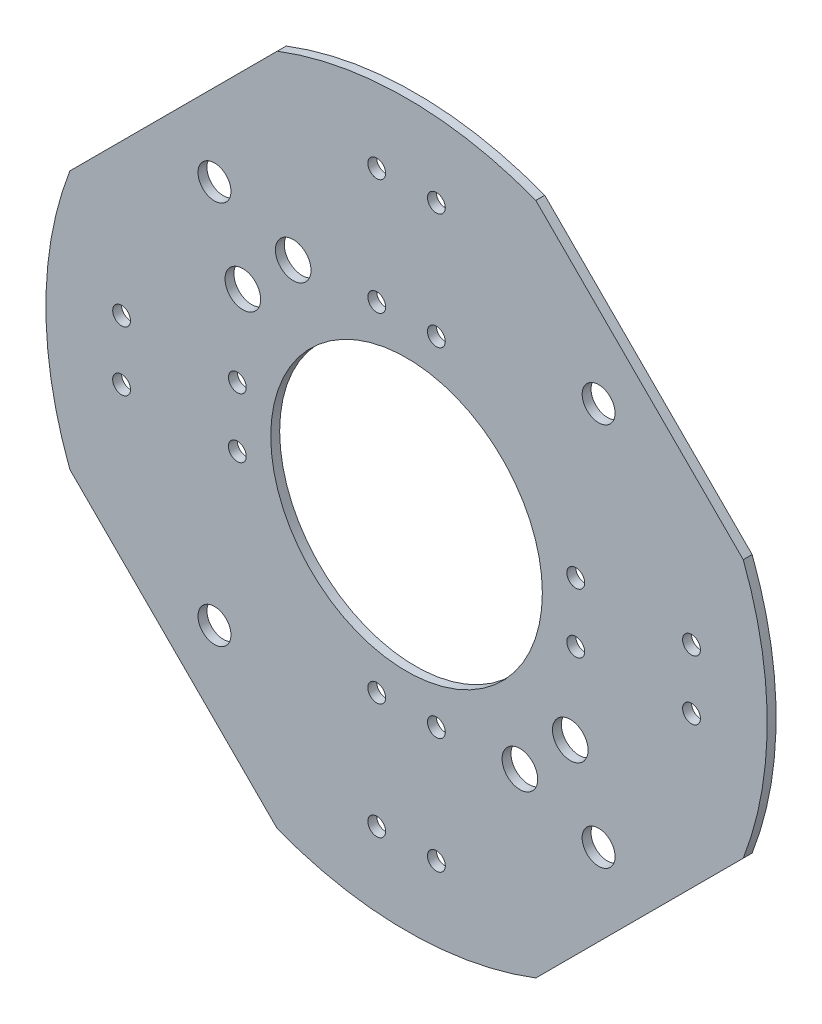
ISO-10303-21;
HEADER;
FILE_DESCRIPTION(('STEP AP214'),'2;1');
FILE_NAME('part.step','',(''),(''),'','','');
FILE_SCHEMA(('AUTOMOTIVE_DESIGN { 1 0 10303 214 1 1 1 1 }'));
ENDSEC;
DATA;
#1=APPLICATION_CONTEXT('core data for automotive mechanical design processes');
#2=APPLICATION_PROTOCOL_DEFINITION('international standard','automotive_design',2000,#1);
#3=PRODUCT_CONTEXT('',#1,'mechanical');
#4=PRODUCT('Part','Part','',(#3));
#5=PRODUCT_RELATED_PRODUCT_CATEGORY('part','',(#4));
#6=PRODUCT_DEFINITION_FORMATION('','',#4);
#7=PRODUCT_DEFINITION_CONTEXT('part definition',#1,'design');
#8=PRODUCT_DEFINITION('design','',#6,#7);
#9=PRODUCT_DEFINITION_SHAPE('','',#8);
#10=(LENGTH_UNIT() NAMED_UNIT(*) SI_UNIT(.MILLI.,.METRE.));
#11=(NAMED_UNIT(*) PLANE_ANGLE_UNIT() SI_UNIT($,.RADIAN.));
#12=(NAMED_UNIT(*) SI_UNIT($,.STERADIAN.) SOLID_ANGLE_UNIT());
#13=UNCERTAINTY_MEASURE_WITH_UNIT(LENGTH_MEASURE(1.E-05),#10,'distance_accuracy_value','');
#14=(GEOMETRIC_REPRESENTATION_CONTEXT(3) GLOBAL_UNCERTAINTY_ASSIGNED_CONTEXT((#13)) GLOBAL_UNIT_ASSIGNED_CONTEXT((#10,
#11,#12)) REPRESENTATION_CONTEXT('',''));
#15=CARTESIAN_POINT('',(0.,0.,0.));
#16=DIRECTION('',(0.,0.,1.));
#17=DIRECTION('',(1.,0.,0.));
#18=AXIS2_PLACEMENT_3D('',#15,#16,#17);
#19=CARTESIAN_POINT('',(0.,0.,1.));
#20=DIRECTION('',(0.,0.,1.));
#21=DIRECTION('',(1.,0.,0.));
#22=AXIS2_PLACEMENT_3D('',#19,#20,#21);
#23=PLANE('',#22);
#24=CARTESIAN_POINT('',(-3.35,-32.,1.));
#25=DIRECTION('',(0.,0.,1.));
#26=DIRECTION('',(1.,0.,0.));
#27=AXIS2_PLACEMENT_3D('',#24,#25,#26);
#28=CIRCLE('',#27,1.);
#29=CARTESIAN_POINT('',(-2.35,-32.,1.));
#30=VERTEX_POINT('',#29);
#31=EDGE_CURVE('E313',#30,#30,#28,.T.);
#32=ORIENTED_EDGE('',*,*,#31,.F.);
#33=EDGE_LOOP('',(#32));
#34=FACE_BOUND('',#33,.T.);
#35=CARTESIAN_POINT('',(3.35,-19.,1.));
#36=DIRECTION('',(0.,0.,1.));
#37=DIRECTION('',(-1.,0.,0.));
#38=AXIS2_PLACEMENT_3D('',#35,#36,#37);
#39=CIRCLE('',#38,1.);
#40=CARTESIAN_POINT('',(2.35,-19.,1.));
#41=VERTEX_POINT('',#40);
#42=EDGE_CURVE('E301',#41,#41,#39,.T.);
#43=ORIENTED_EDGE('',*,*,#42,.F.);
#44=EDGE_LOOP('',(#43));
#45=FACE_BOUND('',#44,.T.);
#46=CARTESIAN_POINT('',(-3.35,32.,1.));
#47=DIRECTION('',(0.,0.,1.));
#48=DIRECTION('',(-1.,0.,0.));
#49=AXIS2_PLACEMENT_3D('',#46,#47,#48);
#50=CIRCLE('',#49,1.);
#51=CARTESIAN_POINT('',(-4.35,32.,1.));
#52=VERTEX_POINT('',#51);
#53=EDGE_CURVE('E289',#52,#52,#50,.T.);
#54=ORIENTED_EDGE('',*,*,#53,.F.);
#55=EDGE_LOOP('',(#54));
#56=FACE_BOUND('',#55,.T.);
#57=CARTESIAN_POINT('',(3.35,19.,1.));
#58=DIRECTION('',(0.,0.,1.));
#59=DIRECTION('',(1.,0.,0.));
#60=AXIS2_PLACEMENT_3D('',#57,#58,#59);
#61=CIRCLE('',#60,1.);
#62=CARTESIAN_POINT('',(4.35,19.,1.));
#63=VERTEX_POINT('',#62);
#64=EDGE_CURVE('E277',#63,#63,#61,.T.);
#65=ORIENTED_EDGE('',*,*,#64,.F.);
#66=EDGE_LOOP('',(#65));
#67=FACE_BOUND('',#66,.T.);
#68=CARTESIAN_POINT('',(-32.,3.35,1.));
#69=DIRECTION('',(0.,0.,1.));
#70=DIRECTION('',(1.,0.,0.));
#71=AXIS2_PLACEMENT_3D('',#68,#69,#70);
#72=CIRCLE('',#71,0.999999999999998);
#73=CARTESIAN_POINT('',(-31.,3.35,1.));
#74=VERTEX_POINT('',#73);
#75=EDGE_CURVE('E265',#74,#74,#72,.T.);
#76=ORIENTED_EDGE('',*,*,#75,.F.);
#77=EDGE_LOOP('',(#76));
#78=FACE_BOUND('',#77,.T.);
#79=CARTESIAN_POINT('',(-19.,-3.35,1.));
#80=DIRECTION('',(0.,0.,1.));
#81=DIRECTION('',(-1.,0.,0.));
#82=AXIS2_PLACEMENT_3D('',#79,#80,#81);
#83=CIRCLE('',#82,1.);
#84=CARTESIAN_POINT('',(-20.,-3.35,1.));
#85=VERTEX_POINT('',#84);
#86=EDGE_CURVE('E253',#85,#85,#83,.T.);
#87=ORIENTED_EDGE('',*,*,#86,.F.);
#88=EDGE_LOOP('',(#87));
#89=FACE_BOUND('',#88,.T.);
#90=CARTESIAN_POINT('',(32.,3.35,1.));
#91=DIRECTION('',(0.,0.,1.));
#92=DIRECTION('',(-1.,0.,0.));
#93=AXIS2_PLACEMENT_3D('',#90,#91,#92);
#94=CIRCLE('',#93,0.999999999999998);
#95=CARTESIAN_POINT('',(31.,3.35,1.));
#96=VERTEX_POINT('',#95);
#97=EDGE_CURVE('E241',#96,#96,#94,.T.);
#98=ORIENTED_EDGE('',*,*,#97,.F.);
#99=EDGE_LOOP('',(#98));
#100=FACE_BOUND('',#99,.T.);
#101=CARTESIAN_POINT('',(19.,-3.35,1.));
#102=DIRECTION('',(0.,0.,1.));
#103=DIRECTION('',(1.,0.,0.));
#104=AXIS2_PLACEMENT_3D('',#101,#102,#103);
#105=CIRCLE('',#104,1.);
#106=CARTESIAN_POINT('',(20.,-3.35,1.));
#107=VERTEX_POINT('',#106);
#108=EDGE_CURVE('E229',#107,#107,#105,.T.);
#109=ORIENTED_EDGE('',*,*,#108,.F.);
#110=EDGE_LOOP('',(#109));
#111=FACE_BOUND('',#110,.T.);
#112=CARTESIAN_POINT('',(12.7279220613578,-18.3847763108502,1.));
#113=DIRECTION('',(0.,0.,1.));
#114=DIRECTION('',(1.,0.,0.));
#115=AXIS2_PLACEMENT_3D('',#112,#113,#114);
#116=CIRCLE('',#115,2.);
#117=CARTESIAN_POINT('',(14.7279220613578,-18.3847763108502,1.));
#118=VERTEX_POINT('',#117);
#119=EDGE_CURVE('E217',#118,#118,#116,.T.);
#120=ORIENTED_EDGE('',*,*,#119,.F.);
#121=EDGE_LOOP('',(#120));
#122=FACE_BOUND('',#121,.T.);
#123=CARTESIAN_POINT('',(-12.7279220613579,18.3847763108502,1.));
#124=DIRECTION('',(0.,0.,1.));
#125=DIRECTION('',(1.,0.,0.));
#126=AXIS2_PLACEMENT_3D('',#123,#124,#125);
#127=CIRCLE('',#126,2.);
#128=CARTESIAN_POINT('',(-10.7279220613579,18.3847763108502,1.));
#129=VERTEX_POINT('',#128);
#130=EDGE_CURVE('E205',#129,#129,#127,.T.);
#131=ORIENTED_EDGE('',*,*,#130,.F.);
#132=EDGE_LOOP('',(#131));
#133=FACE_BOUND('',#132,.T.);
#134=CARTESIAN_POINT('',(-21.5667568261897,21.5667568261897,1.));
#135=DIRECTION('',(0.,0.,1.));
#136=DIRECTION('',(1.,0.,0.));
#137=AXIS2_PLACEMENT_3D('',#134,#135,#136);
#138=CIRCLE('',#137,1.85);
#139=CARTESIAN_POINT('',(-19.7167568261897,21.5667568261897,1.));
#140=VERTEX_POINT('',#139);
#141=EDGE_CURVE('E193',#140,#140,#138,.T.);
#142=ORIENTED_EDGE('',*,*,#141,.F.);
#143=EDGE_LOOP('',(#142));
#144=FACE_BOUND('',#143,.T.);
#145=CARTESIAN_POINT('',(21.5667568261897,21.5667568261897,1.));
#146=DIRECTION('',(0.,0.,1.));
#147=DIRECTION('',(1.,0.,0.));
#148=AXIS2_PLACEMENT_3D('',#145,#146,#147);
#149=CIRCLE('',#148,1.85);
#150=CARTESIAN_POINT('',(23.4167568261897,21.5667568261897,1.));
#151=VERTEX_POINT('',#150);
#152=EDGE_CURVE('E181',#151,#151,#149,.T.);
#153=ORIENTED_EDGE('',*,*,#152,.F.);
#154=EDGE_LOOP('',(#153));
#155=FACE_BOUND('',#154,.T.);
#156=CARTESIAN_POINT('',(0.,0.,1.));
#157=DIRECTION('',(0.,0.,1.));
#158=DIRECTION('',(1.,0.,0.));
#159=AXIS2_PLACEMENT_3D('',#156,#157,#158);
#160=CIRCLE('',#159,40.5);
#161=CARTESIAN_POINT('',(37.8087656027544,-14.5171362050501,1.));
#162=VERTEX_POINT('',#161);
#163=CARTESIAN_POINT('',(37.8087656027544,14.5171362050501,1.));
#164=VERTEX_POINT('',#163);
#165=EDGE_CURVE('E144',#162,#164,#160,.T.);
#166=ORIENTED_EDGE('',*,*,#165,.T.);
#167=DIRECTION('',(-0.707106781186547,0.707106781186548,0.));
#168=VECTOR('',#167,1.);
#169=CARTESIAN_POINT('',(37.8087656027544,14.5171362050501,1.));
#170=LINE('',#169,#168);
#171=CARTESIAN_POINT('',(14.5171362050501,37.8087656027544,1.));
#172=VERTEX_POINT('',#171);
#173=EDGE_CURVE('E92',#164,#172,#170,.T.);
#174=ORIENTED_EDGE('',*,*,#173,.T.);
#175=CARTESIAN_POINT('',(0.,0.,1.));
#176=DIRECTION('',(0.,0.,1.));
#177=DIRECTION('',(1.,0.,0.));
#178=AXIS2_PLACEMENT_3D('',#175,#176,#177);
#179=CIRCLE('',#178,40.5);
#180=CARTESIAN_POINT('',(-14.5171362050501,37.8087656027544,1.));
#181=VERTEX_POINT('',#180);
#182=EDGE_CURVE('E159',#172,#181,#179,.T.);
#183=ORIENTED_EDGE('',*,*,#182,.T.);
#184=DIRECTION('',(-0.707106781186547,-0.707106781186548,0.));
#185=VECTOR('',#184,1.);
#186=CARTESIAN_POINT('',(-14.5171362050501,37.8087656027544,1.));
#187=LINE('',#186,#185);
#188=CARTESIAN_POINT('',(-37.8087656027544,14.5171362050501,1.));
#189=VERTEX_POINT('',#188);
#190=EDGE_CURVE('E172',#181,#189,#187,.T.);
#191=ORIENTED_EDGE('',*,*,#190,.T.);
#192=CARTESIAN_POINT('',(0.,0.,1.));
#193=DIRECTION('',(0.,0.,1.));
#194=DIRECTION('',(1.,0.,0.));
#195=AXIS2_PLACEMENT_3D('',#192,#193,#194);
#196=CIRCLE('',#195,40.5);
#197=CARTESIAN_POINT('',(-37.8087656027544,-14.5171362050501,1.));
#198=VERTEX_POINT('',#197);
#199=EDGE_CURVE('E111',#189,#198,#196,.T.);
#200=ORIENTED_EDGE('',*,*,#199,.T.);
#201=DIRECTION('',(0.707106781186547,-0.707106781186548,0.));
#202=VECTOR('',#201,1.);
#203=CARTESIAN_POINT('',(-14.5171362050501,-37.8087656027544,1.));
#204=LINE('',#203,#202);
#205=CARTESIAN_POINT('',(-14.5171362050501,-37.8087656027544,1.));
#206=VERTEX_POINT('',#205);
#207=EDGE_CURVE('E105',#198,#206,#204,.T.);
#208=ORIENTED_EDGE('',*,*,#207,.T.);
#209=CARTESIAN_POINT('',(0.,0.,1.));
#210=DIRECTION('',(0.,0.,1.));
#211=DIRECTION('',(1.,0.,0.));
#212=AXIS2_PLACEMENT_3D('',#209,#210,#211);
#213=CIRCLE('',#212,40.5);
#214=CARTESIAN_POINT('',(14.5171362050501,-37.8087656027544,1.));
#215=VERTEX_POINT('',#214);
#216=EDGE_CURVE('E109',#206,#215,#213,.T.);
#217=ORIENTED_EDGE('',*,*,#216,.T.);
#218=DIRECTION('',(0.707106781186548,0.707106781186548,0.));
#219=VECTOR('',#218,1.);
#220=CARTESIAN_POINT('',(37.8087656027544,-14.5171362050501,1.));
#221=LINE('',#220,#219);
#222=EDGE_CURVE('E49',#215,#162,#221,.T.);
#223=ORIENTED_EDGE('',*,*,#222,.T.);
#224=EDGE_LOOP('',(#166,#174,#183,#191,#200,#208,#217,#223));
#225=FACE_BOUND('',#224,.T.);
#226=CARTESIAN_POINT('',(0.,0.,1.));
#227=DIRECTION('',(0.,0.,1.));
#228=DIRECTION('',(1.,0.,0.));
#229=AXIS2_PLACEMENT_3D('',#226,#227,#228);
#230=CIRCLE('',#229,15.25);
#231=CARTESIAN_POINT('',(15.25,0.,1.));
#232=VERTEX_POINT('',#231);
#233=EDGE_CURVE('E133',#232,#232,#230,.T.);
#234=ORIENTED_EDGE('',*,*,#233,.F.);
#235=EDGE_LOOP('',(#234));
#236=FACE_BOUND('',#235,.T.);
#237=CARTESIAN_POINT('',(-21.5667568261897,-21.5667568261897,1.));
#238=DIRECTION('',(0.,0.,1.));
#239=DIRECTION('',(-1.,0.,0.));
#240=AXIS2_PLACEMENT_3D('',#237,#238,#239);
#241=CIRCLE('',#240,1.85);
#242=CARTESIAN_POINT('',(-23.4167568261897,-21.5667568261897,1.));
#243=VERTEX_POINT('',#242);
#244=EDGE_CURVE('E187',#243,#243,#241,.T.);
#245=ORIENTED_EDGE('',*,*,#244,.F.);
#246=EDGE_LOOP('',(#245));
#247=FACE_BOUND('',#246,.T.);
#248=CARTESIAN_POINT('',(21.5667568261897,-21.5667568261897,1.));
#249=DIRECTION('',(0.,0.,1.));
#250=DIRECTION('',(-1.,0.,0.));
#251=AXIS2_PLACEMENT_3D('',#248,#249,#250);
#252=CIRCLE('',#251,1.85);
#253=CARTESIAN_POINT('',(19.7167568261897,-21.5667568261897,1.));
#254=VERTEX_POINT('',#253);
#255=EDGE_CURVE('E199',#254,#254,#252,.T.);
#256=ORIENTED_EDGE('',*,*,#255,.F.);
#257=EDGE_LOOP('',(#256));
#258=FACE_BOUND('',#257,.T.);
#259=CARTESIAN_POINT('',(-18.3847763108502,12.7279220613579,1.));
#260=DIRECTION('',(0.,0.,1.));
#261=DIRECTION('',(-1.,0.,0.));
#262=AXIS2_PLACEMENT_3D('',#259,#260,#261);
#263=CIRCLE('',#262,2.);
#264=CARTESIAN_POINT('',(-20.3847763108502,12.7279220613579,1.));
#265=VERTEX_POINT('',#264);
#266=EDGE_CURVE('E211',#265,#265,#263,.T.);
#267=ORIENTED_EDGE('',*,*,#266,.F.);
#268=EDGE_LOOP('',(#267));
#269=FACE_BOUND('',#268,.T.);
#270=CARTESIAN_POINT('',(18.3847763108502,-12.7279220613579,1.));
#271=DIRECTION('',(0.,0.,1.));
#272=DIRECTION('',(-1.,0.,0.));
#273=AXIS2_PLACEMENT_3D('',#270,#271,#272);
#274=CIRCLE('',#273,2.);
#275=CARTESIAN_POINT('',(16.3847763108502,-12.7279220613579,1.));
#276=VERTEX_POINT('',#275);
#277=EDGE_CURVE('E223',#276,#276,#274,.T.);
#278=ORIENTED_EDGE('',*,*,#277,.F.);
#279=EDGE_LOOP('',(#278));
#280=FACE_BOUND('',#279,.T.);
#281=CARTESIAN_POINT('',(32.,-3.35,1.));
#282=DIRECTION('',(0.,0.,1.));
#283=DIRECTION('',(1.,0.,0.));
#284=AXIS2_PLACEMENT_3D('',#281,#282,#283);
#285=CIRCLE('',#284,0.999999999999998);
#286=CARTESIAN_POINT('',(33.,-3.35,1.));
#287=VERTEX_POINT('',#286);
#288=EDGE_CURVE('E235',#287,#287,#285,.T.);
#289=ORIENTED_EDGE('',*,*,#288,.F.);
#290=EDGE_LOOP('',(#289));
#291=FACE_BOUND('',#290,.T.);
#292=CARTESIAN_POINT('',(19.,3.35,1.));
#293=DIRECTION('',(0.,0.,1.));
#294=DIRECTION('',(-1.,0.,0.));
#295=AXIS2_PLACEMENT_3D('',#292,#293,#294);
#296=CIRCLE('',#295,1.);
#297=CARTESIAN_POINT('',(18.,3.35,1.));
#298=VERTEX_POINT('',#297);
#299=EDGE_CURVE('E247',#298,#298,#296,.T.);
#300=ORIENTED_EDGE('',*,*,#299,.F.);
#301=EDGE_LOOP('',(#300));
#302=FACE_BOUND('',#301,.T.);
#303=CARTESIAN_POINT('',(-32.,-3.35,1.));
#304=DIRECTION('',(0.,0.,1.));
#305=DIRECTION('',(-1.,0.,0.));
#306=AXIS2_PLACEMENT_3D('',#303,#304,#305);
#307=CIRCLE('',#306,0.999999999999998);
#308=CARTESIAN_POINT('',(-33.,-3.35,1.));
#309=VERTEX_POINT('',#308);
#310=EDGE_CURVE('E259',#309,#309,#307,.T.);
#311=ORIENTED_EDGE('',*,*,#310,.F.);
#312=EDGE_LOOP('',(#311));
#313=FACE_BOUND('',#312,.T.);
#314=CARTESIAN_POINT('',(-19.,3.35,1.));
#315=DIRECTION('',(0.,0.,1.));
#316=DIRECTION('',(1.,0.,0.));
#317=AXIS2_PLACEMENT_3D('',#314,#315,#316);
#318=CIRCLE('',#317,1.);
#319=CARTESIAN_POINT('',(-18.,3.35,1.));
#320=VERTEX_POINT('',#319);
#321=EDGE_CURVE('E271',#320,#320,#318,.T.);
#322=ORIENTED_EDGE('',*,*,#321,.F.);
#323=EDGE_LOOP('',(#322));
#324=FACE_BOUND('',#323,.T.);
#325=CARTESIAN_POINT('',(3.35,32.,1.));
#326=DIRECTION('',(0.,0.,1.));
#327=DIRECTION('',(1.,0.,0.));
#328=AXIS2_PLACEMENT_3D('',#325,#326,#327);
#329=CIRCLE('',#328,1.);
#330=CARTESIAN_POINT('',(4.35,32.,1.));
#331=VERTEX_POINT('',#330);
#332=EDGE_CURVE('E283',#331,#331,#329,.T.);
#333=ORIENTED_EDGE('',*,*,#332,.F.);
#334=EDGE_LOOP('',(#333));
#335=FACE_BOUND('',#334,.T.);
#336=CARTESIAN_POINT('',(-3.35,19.,1.));
#337=DIRECTION('',(0.,0.,1.));
#338=DIRECTION('',(-1.,0.,0.));
#339=AXIS2_PLACEMENT_3D('',#336,#337,#338);
#340=CIRCLE('',#339,1.);
#341=CARTESIAN_POINT('',(-4.35,19.,1.));
#342=VERTEX_POINT('',#341);
#343=EDGE_CURVE('E295',#342,#342,#340,.T.);
#344=ORIENTED_EDGE('',*,*,#343,.F.);
#345=EDGE_LOOP('',(#344));
#346=FACE_BOUND('',#345,.T.);
#347=CARTESIAN_POINT('',(3.35,-32.,1.));
#348=DIRECTION('',(0.,0.,1.));
#349=DIRECTION('',(-1.,0.,0.));
#350=AXIS2_PLACEMENT_3D('',#347,#348,#349);
#351=CIRCLE('',#350,1.);
#352=CARTESIAN_POINT('',(2.35,-32.,1.));
#353=VERTEX_POINT('',#352);
#354=EDGE_CURVE('E307',#353,#353,#351,.T.);
#355=ORIENTED_EDGE('',*,*,#354,.F.);
#356=EDGE_LOOP('',(#355));
#357=FACE_BOUND('',#356,.T.);
#358=CARTESIAN_POINT('',(-3.35,-19.,1.));
#359=DIRECTION('',(0.,0.,1.));
#360=DIRECTION('',(1.,0.,0.));
#361=AXIS2_PLACEMENT_3D('',#358,#359,#360);
#362=CIRCLE('',#361,1.);
#363=CARTESIAN_POINT('',(-2.35,-19.,1.));
#364=VERTEX_POINT('',#363);
#365=EDGE_CURVE('E319',#364,#364,#362,.T.);
#366=ORIENTED_EDGE('',*,*,#365,.F.);
#367=EDGE_LOOP('',(#366));
#368=FACE_BOUND('',#367,.T.);
#369=ADVANCED_FACE('F32',(#34,#45,#56,#67,#78,#89,#100,#111,#122,#133,#144,#155,#225,#236,#247,
#258,#269,#280,#291,#302,#313,#324,#335,#346,#357,#368),#23,.T.);
#370=CARTESIAN_POINT('',(0.,0.,0.));
#371=DIRECTION('',(0.,0.,1.));
#372=DIRECTION('',(1.,0.,0.));
#373=AXIS2_PLACEMENT_3D('',#370,#371,#372);
#374=PLANE('',#373);
#375=CARTESIAN_POINT('',(-3.35,-32.,0.));
#376=DIRECTION('',(0.,0.,1.));
#377=DIRECTION('',(1.,0.,0.));
#378=AXIS2_PLACEMENT_3D('',#375,#376,#377);
#379=CIRCLE('',#378,1.);
#380=CARTESIAN_POINT('',(-2.35,-32.,0.));
#381=VERTEX_POINT('',#380);
#382=EDGE_CURVE('E316',#381,#381,#379,.T.);
#383=ORIENTED_EDGE('',*,*,#382,.T.);
#384=EDGE_LOOP('',(#383));
#385=FACE_BOUND('',#384,.T.);
#386=CARTESIAN_POINT('',(3.35,-19.,0.));
#387=DIRECTION('',(0.,0.,1.));
#388=DIRECTION('',(-1.,0.,0.));
#389=AXIS2_PLACEMENT_3D('',#386,#387,#388);
#390=CIRCLE('',#389,1.);
#391=CARTESIAN_POINT('',(2.35,-19.,0.));
#392=VERTEX_POINT('',#391);
#393=EDGE_CURVE('E304',#392,#392,#390,.T.);
#394=ORIENTED_EDGE('',*,*,#393,.T.);
#395=EDGE_LOOP('',(#394));
#396=FACE_BOUND('',#395,.T.);
#397=CARTESIAN_POINT('',(-3.35,32.,0.));
#398=DIRECTION('',(0.,0.,1.));
#399=DIRECTION('',(-1.,0.,0.));
#400=AXIS2_PLACEMENT_3D('',#397,#398,#399);
#401=CIRCLE('',#400,1.);
#402=CARTESIAN_POINT('',(-4.35,32.,0.));
#403=VERTEX_POINT('',#402);
#404=EDGE_CURVE('E292',#403,#403,#401,.T.);
#405=ORIENTED_EDGE('',*,*,#404,.T.);
#406=EDGE_LOOP('',(#405));
#407=FACE_BOUND('',#406,.T.);
#408=CARTESIAN_POINT('',(3.35,19.,0.));
#409=DIRECTION('',(0.,0.,1.));
#410=DIRECTION('',(1.,0.,0.));
#411=AXIS2_PLACEMENT_3D('',#408,#409,#410);
#412=CIRCLE('',#411,1.);
#413=CARTESIAN_POINT('',(4.35,19.,0.));
#414=VERTEX_POINT('',#413);
#415=EDGE_CURVE('E280',#414,#414,#412,.T.);
#416=ORIENTED_EDGE('',*,*,#415,.T.);
#417=EDGE_LOOP('',(#416));
#418=FACE_BOUND('',#417,.T.);
#419=CARTESIAN_POINT('',(-32.,3.35,0.));
#420=DIRECTION('',(0.,0.,1.));
#421=DIRECTION('',(1.,0.,0.));
#422=AXIS2_PLACEMENT_3D('',#419,#420,#421);
#423=CIRCLE('',#422,0.999999999999998);
#424=CARTESIAN_POINT('',(-31.,3.35,0.));
#425=VERTEX_POINT('',#424);
#426=EDGE_CURVE('E268',#425,#425,#423,.T.);
#427=ORIENTED_EDGE('',*,*,#426,.T.);
#428=EDGE_LOOP('',(#427));
#429=FACE_BOUND('',#428,.T.);
#430=CARTESIAN_POINT('',(-19.,-3.35,0.));
#431=DIRECTION('',(0.,0.,1.));
#432=DIRECTION('',(-1.,0.,0.));
#433=AXIS2_PLACEMENT_3D('',#430,#431,#432);
#434=CIRCLE('',#433,1.);
#435=CARTESIAN_POINT('',(-20.,-3.35,0.));
#436=VERTEX_POINT('',#435);
#437=EDGE_CURVE('E256',#436,#436,#434,.T.);
#438=ORIENTED_EDGE('',*,*,#437,.T.);
#439=EDGE_LOOP('',(#438));
#440=FACE_BOUND('',#439,.T.);
#441=CARTESIAN_POINT('',(32.,3.35,0.));
#442=DIRECTION('',(0.,0.,1.));
#443=DIRECTION('',(-1.,0.,0.));
#444=AXIS2_PLACEMENT_3D('',#441,#442,#443);
#445=CIRCLE('',#444,0.999999999999998);
#446=CARTESIAN_POINT('',(31.,3.35,0.));
#447=VERTEX_POINT('',#446);
#448=EDGE_CURVE('E244',#447,#447,#445,.T.);
#449=ORIENTED_EDGE('',*,*,#448,.T.);
#450=EDGE_LOOP('',(#449));
#451=FACE_BOUND('',#450,.T.);
#452=CARTESIAN_POINT('',(19.,-3.35,0.));
#453=DIRECTION('',(0.,0.,1.));
#454=DIRECTION('',(1.,0.,0.));
#455=AXIS2_PLACEMENT_3D('',#452,#453,#454);
#456=CIRCLE('',#455,1.);
#457=CARTESIAN_POINT('',(20.,-3.35,0.));
#458=VERTEX_POINT('',#457);
#459=EDGE_CURVE('E232',#458,#458,#456,.T.);
#460=ORIENTED_EDGE('',*,*,#459,.T.);
#461=EDGE_LOOP('',(#460));
#462=FACE_BOUND('',#461,.T.);
#463=CARTESIAN_POINT('',(12.7279220613578,-18.3847763108502,0.));
#464=DIRECTION('',(0.,0.,1.));
#465=DIRECTION('',(1.,0.,0.));
#466=AXIS2_PLACEMENT_3D('',#463,#464,#465);
#467=CIRCLE('',#466,2.);
#468=CARTESIAN_POINT('',(14.7279220613578,-18.3847763108502,0.));
#469=VERTEX_POINT('',#468);
#470=EDGE_CURVE('E220',#469,#469,#467,.T.);
#471=ORIENTED_EDGE('',*,*,#470,.T.);
#472=EDGE_LOOP('',(#471));
#473=FACE_BOUND('',#472,.T.);
#474=CARTESIAN_POINT('',(-12.7279220613579,18.3847763108502,0.));
#475=DIRECTION('',(0.,0.,1.));
#476=DIRECTION('',(1.,0.,0.));
#477=AXIS2_PLACEMENT_3D('',#474,#475,#476);
#478=CIRCLE('',#477,2.);
#479=CARTESIAN_POINT('',(-10.7279220613579,18.3847763108502,0.));
#480=VERTEX_POINT('',#479);
#481=EDGE_CURVE('E208',#480,#480,#478,.T.);
#482=ORIENTED_EDGE('',*,*,#481,.T.);
#483=EDGE_LOOP('',(#482));
#484=FACE_BOUND('',#483,.T.);
#485=CARTESIAN_POINT('',(-21.5667568261897,21.5667568261897,0.));
#486=DIRECTION('',(0.,0.,1.));
#487=DIRECTION('',(1.,0.,0.));
#488=AXIS2_PLACEMENT_3D('',#485,#486,#487);
#489=CIRCLE('',#488,1.85);
#490=CARTESIAN_POINT('',(-19.7167568261897,21.5667568261897,0.));
#491=VERTEX_POINT('',#490);
#492=EDGE_CURVE('E196',#491,#491,#489,.T.);
#493=ORIENTED_EDGE('',*,*,#492,.T.);
#494=EDGE_LOOP('',(#493));
#495=FACE_BOUND('',#494,.T.);
#496=CARTESIAN_POINT('',(21.5667568261897,21.5667568261897,0.));
#497=DIRECTION('',(0.,0.,1.));
#498=DIRECTION('',(1.,0.,0.));
#499=AXIS2_PLACEMENT_3D('',#496,#497,#498);
#500=CIRCLE('',#499,1.85);
#501=CARTESIAN_POINT('',(23.4167568261897,21.5667568261897,0.));
#502=VERTEX_POINT('',#501);
#503=EDGE_CURVE('E184',#502,#502,#500,.T.);
#504=ORIENTED_EDGE('',*,*,#503,.T.);
#505=EDGE_LOOP('',(#504));
#506=FACE_BOUND('',#505,.T.);
#507=CARTESIAN_POINT('',(0.,0.,0.));
#508=DIRECTION('',(0.,0.,1.));
#509=DIRECTION('',(1.,0.,0.));
#510=AXIS2_PLACEMENT_3D('',#507,#508,#509);
#511=CIRCLE('',#510,40.5);
#512=CARTESIAN_POINT('',(37.8087656027544,-14.5171362050501,0.));
#513=VERTEX_POINT('',#512);
#514=CARTESIAN_POINT('',(37.8087656027544,14.5171362050501,0.));
#515=VERTEX_POINT('',#514);
#516=EDGE_CURVE('E129',#513,#515,#511,.T.);
#517=ORIENTED_EDGE('',*,*,#516,.F.);
#518=DIRECTION('',(0.707106781186548,0.707106781186548,0.));
#519=VECTOR('',#518,1.);
#520=CARTESIAN_POINT('',(37.8087656027544,-14.5171362050501,0.));
#521=LINE('',#520,#519);
#522=CARTESIAN_POINT('',(14.5171362050501,-37.8087656027544,0.));
#523=VERTEX_POINT('',#522);
#524=EDGE_CURVE('E84',#523,#513,#521,.T.);
#525=ORIENTED_EDGE('',*,*,#524,.F.);
#526=CARTESIAN_POINT('',(0.,0.,0.));
#527=DIRECTION('',(0.,0.,1.));
#528=DIRECTION('',(1.,0.,0.));
#529=AXIS2_PLACEMENT_3D('',#526,#527,#528);
#530=CIRCLE('',#529,40.5);
#531=CARTESIAN_POINT('',(-14.5171362050501,-37.8087656027544,0.));
#532=VERTEX_POINT('',#531);
#533=EDGE_CURVE('E78',#532,#523,#530,.T.);
#534=ORIENTED_EDGE('',*,*,#533,.F.);
#535=DIRECTION('',(0.707106781186547,-0.707106781186548,0.));
#536=VECTOR('',#535,1.);
#537=CARTESIAN_POINT('',(-14.5171362050501,-37.8087656027544,0.));
#538=LINE('',#537,#536);
#539=CARTESIAN_POINT('',(-37.8087656027544,-14.5171362050501,0.));
#540=VERTEX_POINT('',#539);
#541=EDGE_CURVE('E119',#540,#532,#538,.T.);
#542=ORIENTED_EDGE('',*,*,#541,.F.);
#543=CARTESIAN_POINT('',(0.,0.,0.));
#544=DIRECTION('',(0.,0.,1.));
#545=DIRECTION('',(1.,0.,0.));
#546=AXIS2_PLACEMENT_3D('',#543,#544,#545);
#547=CIRCLE('',#546,40.5);
#548=CARTESIAN_POINT('',(-37.8087656027544,14.5171362050501,0.));
#549=VERTEX_POINT('',#548);
#550=EDGE_CURVE('E139',#549,#540,#547,.T.);
#551=ORIENTED_EDGE('',*,*,#550,.F.);
#552=DIRECTION('',(-0.707106781186547,-0.707106781186548,0.));
#553=VECTOR('',#552,1.);
#554=CARTESIAN_POINT('',(-14.5171362050501,37.8087656027544,0.));
#555=LINE('',#554,#553);
#556=CARTESIAN_POINT('',(-14.5171362050501,37.8087656027544,0.));
#557=VERTEX_POINT('',#556);
#558=EDGE_CURVE('E137',#557,#549,#555,.T.);
#559=ORIENTED_EDGE('',*,*,#558,.F.);
#560=CARTESIAN_POINT('',(0.,0.,0.));
#561=DIRECTION('',(0.,0.,1.));
#562=DIRECTION('',(1.,0.,0.));
#563=AXIS2_PLACEMENT_3D('',#560,#561,#562);
#564=CIRCLE('',#563,40.5);
#565=CARTESIAN_POINT('',(14.5171362050501,37.8087656027544,0.));
#566=VERTEX_POINT('',#565);
#567=EDGE_CURVE('E135',#566,#557,#564,.T.);
#568=ORIENTED_EDGE('',*,*,#567,.F.);
#569=DIRECTION('',(-0.707106781186547,0.707106781186548,0.));
#570=VECTOR('',#569,1.);
#571=CARTESIAN_POINT('',(37.8087656027544,14.5171362050501,0.));
#572=LINE('',#571,#570);
#573=EDGE_CURVE('E132',#515,#566,#572,.T.);
#574=ORIENTED_EDGE('',*,*,#573,.F.);
#575=EDGE_LOOP('',(#517,#525,#534,#542,#551,#559,#568,#574));
#576=FACE_BOUND('',#575,.T.);
#577=CARTESIAN_POINT('',(0.,0.,0.));
#578=DIRECTION('',(0.,0.,1.));
#579=DIRECTION('',(1.,0.,0.));
#580=AXIS2_PLACEMENT_3D('',#577,#578,#579);
#581=CIRCLE('',#580,15.25);
#582=CARTESIAN_POINT('',(15.25,0.,0.));
#583=VERTEX_POINT('',#582);
#584=EDGE_CURVE('E178',#583,#583,#581,.T.);
#585=ORIENTED_EDGE('',*,*,#584,.T.);
#586=EDGE_LOOP('',(#585));
#587=FACE_BOUND('',#586,.T.);
#588=CARTESIAN_POINT('',(-21.5667568261897,-21.5667568261897,0.));
#589=DIRECTION('',(0.,0.,1.));
#590=DIRECTION('',(-1.,0.,0.));
#591=AXIS2_PLACEMENT_3D('',#588,#589,#590);
#592=CIRCLE('',#591,1.85);
#593=CARTESIAN_POINT('',(-23.4167568261897,-21.5667568261897,0.));
#594=VERTEX_POINT('',#593);
#595=EDGE_CURVE('E190',#594,#594,#592,.T.);
#596=ORIENTED_EDGE('',*,*,#595,.T.);
#597=EDGE_LOOP('',(#596));
#598=FACE_BOUND('',#597,.T.);
#599=CARTESIAN_POINT('',(21.5667568261897,-21.5667568261897,0.));
#600=DIRECTION('',(0.,0.,1.));
#601=DIRECTION('',(-1.,0.,0.));
#602=AXIS2_PLACEMENT_3D('',#599,#600,#601);
#603=CIRCLE('',#602,1.85);
#604=CARTESIAN_POINT('',(19.7167568261897,-21.5667568261897,0.));
#605=VERTEX_POINT('',#604);
#606=EDGE_CURVE('E202',#605,#605,#603,.T.);
#607=ORIENTED_EDGE('',*,*,#606,.T.);
#608=EDGE_LOOP('',(#607));
#609=FACE_BOUND('',#608,.T.);
#610=CARTESIAN_POINT('',(-18.3847763108502,12.7279220613579,0.));
#611=DIRECTION('',(0.,0.,1.));
#612=DIRECTION('',(-1.,0.,0.));
#613=AXIS2_PLACEMENT_3D('',#610,#611,#612);
#614=CIRCLE('',#613,2.);
#615=CARTESIAN_POINT('',(-20.3847763108502,12.7279220613579,0.));
#616=VERTEX_POINT('',#615);
#617=EDGE_CURVE('E214',#616,#616,#614,.T.);
#618=ORIENTED_EDGE('',*,*,#617,.T.);
#619=EDGE_LOOP('',(#618));
#620=FACE_BOUND('',#619,.T.);
#621=CARTESIAN_POINT('',(18.3847763108502,-12.7279220613579,0.));
#622=DIRECTION('',(0.,0.,1.));
#623=DIRECTION('',(-1.,0.,0.));
#624=AXIS2_PLACEMENT_3D('',#621,#622,#623);
#625=CIRCLE('',#624,2.);
#626=CARTESIAN_POINT('',(16.3847763108502,-12.7279220613579,0.));
#627=VERTEX_POINT('',#626);
#628=EDGE_CURVE('E226',#627,#627,#625,.T.);
#629=ORIENTED_EDGE('',*,*,#628,.T.);
#630=EDGE_LOOP('',(#629));
#631=FACE_BOUND('',#630,.T.);
#632=CARTESIAN_POINT('',(32.,-3.35,0.));
#633=DIRECTION('',(0.,0.,1.));
#634=DIRECTION('',(1.,0.,0.));
#635=AXIS2_PLACEMENT_3D('',#632,#633,#634);
#636=CIRCLE('',#635,0.999999999999998);
#637=CARTESIAN_POINT('',(33.,-3.35,0.));
#638=VERTEX_POINT('',#637);
#639=EDGE_CURVE('E238',#638,#638,#636,.T.);
#640=ORIENTED_EDGE('',*,*,#639,.T.);
#641=EDGE_LOOP('',(#640));
#642=FACE_BOUND('',#641,.T.);
#643=CARTESIAN_POINT('',(19.,3.35,0.));
#644=DIRECTION('',(0.,0.,1.));
#645=DIRECTION('',(-1.,0.,0.));
#646=AXIS2_PLACEMENT_3D('',#643,#644,#645);
#647=CIRCLE('',#646,1.);
#648=CARTESIAN_POINT('',(18.,3.35,0.));
#649=VERTEX_POINT('',#648);
#650=EDGE_CURVE('E250',#649,#649,#647,.T.);
#651=ORIENTED_EDGE('',*,*,#650,.T.);
#652=EDGE_LOOP('',(#651));
#653=FACE_BOUND('',#652,.T.);
#654=CARTESIAN_POINT('',(-32.,-3.35,0.));
#655=DIRECTION('',(0.,0.,1.));
#656=DIRECTION('',(-1.,0.,0.));
#657=AXIS2_PLACEMENT_3D('',#654,#655,#656);
#658=CIRCLE('',#657,0.999999999999998);
#659=CARTESIAN_POINT('',(-33.,-3.35,0.));
#660=VERTEX_POINT('',#659);
#661=EDGE_CURVE('E262',#660,#660,#658,.T.);
#662=ORIENTED_EDGE('',*,*,#661,.T.);
#663=EDGE_LOOP('',(#662));
#664=FACE_BOUND('',#663,.T.);
#665=CARTESIAN_POINT('',(-19.,3.35,0.));
#666=DIRECTION('',(0.,0.,1.));
#667=DIRECTION('',(1.,0.,0.));
#668=AXIS2_PLACEMENT_3D('',#665,#666,#667);
#669=CIRCLE('',#668,1.);
#670=CARTESIAN_POINT('',(-18.,3.35,0.));
#671=VERTEX_POINT('',#670);
#672=EDGE_CURVE('E274',#671,#671,#669,.T.);
#673=ORIENTED_EDGE('',*,*,#672,.T.);
#674=EDGE_LOOP('',(#673));
#675=FACE_BOUND('',#674,.T.);
#676=CARTESIAN_POINT('',(3.35,32.,0.));
#677=DIRECTION('',(0.,0.,1.));
#678=DIRECTION('',(1.,0.,0.));
#679=AXIS2_PLACEMENT_3D('',#676,#677,#678);
#680=CIRCLE('',#679,1.);
#681=CARTESIAN_POINT('',(4.35,32.,0.));
#682=VERTEX_POINT('',#681);
#683=EDGE_CURVE('E286',#682,#682,#680,.T.);
#684=ORIENTED_EDGE('',*,*,#683,.T.);
#685=EDGE_LOOP('',(#684));
#686=FACE_BOUND('',#685,.T.);
#687=CARTESIAN_POINT('',(-3.35,19.,0.));
#688=DIRECTION('',(0.,0.,1.));
#689=DIRECTION('',(-1.,0.,0.));
#690=AXIS2_PLACEMENT_3D('',#687,#688,#689);
#691=CIRCLE('',#690,1.);
#692=CARTESIAN_POINT('',(-4.35,19.,0.));
#693=VERTEX_POINT('',#692);
#694=EDGE_CURVE('E298',#693,#693,#691,.T.);
#695=ORIENTED_EDGE('',*,*,#694,.T.);
#696=EDGE_LOOP('',(#695));
#697=FACE_BOUND('',#696,.T.);
#698=CARTESIAN_POINT('',(3.35,-32.,0.));
#699=DIRECTION('',(0.,0.,1.));
#700=DIRECTION('',(-1.,0.,0.));
#701=AXIS2_PLACEMENT_3D('',#698,#699,#700);
#702=CIRCLE('',#701,1.);
#703=CARTESIAN_POINT('',(2.35,-32.,0.));
#704=VERTEX_POINT('',#703);
#705=EDGE_CURVE('E310',#704,#704,#702,.T.);
#706=ORIENTED_EDGE('',*,*,#705,.T.);
#707=EDGE_LOOP('',(#706));
#708=FACE_BOUND('',#707,.T.);
#709=CARTESIAN_POINT('',(-3.35,-19.,0.));
#710=DIRECTION('',(0.,0.,1.));
#711=DIRECTION('',(1.,0.,0.));
#712=AXIS2_PLACEMENT_3D('',#709,#710,#711);
#713=CIRCLE('',#712,1.);
#714=CARTESIAN_POINT('',(-2.35,-19.,0.));
#715=VERTEX_POINT('',#714);
#716=EDGE_CURVE('E322',#715,#715,#713,.T.);
#717=ORIENTED_EDGE('',*,*,#716,.T.);
#718=EDGE_LOOP('',(#717));
#719=FACE_BOUND('',#718,.T.);
#720=ADVANCED_FACE('F163',(#385,#396,#407,#418,#429,#440,#451,#462,#473,#484,#495,#506,#576,
#587,#598,#609,#620,#631,#642,#653,#664,#675,#686,#697,#708,#719),#374,.F.);
#721=CARTESIAN_POINT('',(0.,0.,1.));
#722=DIRECTION('',(0.,0.,-1.));
#723=DIRECTION('',(-1.,0.,0.));
#724=AXIS2_PLACEMENT_3D('',#721,#722,#723);
#725=CYLINDRICAL_SURFACE('',#724,40.5);
#726=ORIENTED_EDGE('',*,*,#516,.T.);
#727=DIRECTION('',(0.,0.,-1.));
#728=VECTOR('',#727,1.);
#729=CARTESIAN_POINT('',(37.8087656027544,14.5171362050501,1.));
#730=LINE('',#729,#728);
#731=EDGE_CURVE('E11',#164,#515,#730,.T.);
#732=ORIENTED_EDGE('',*,*,#731,.F.);
#733=ORIENTED_EDGE('',*,*,#165,.F.);
#734=DIRECTION('',(0.,0.,-1.));
#735=VECTOR('',#734,1.);
#736=CARTESIAN_POINT('',(37.8087656027544,-14.5171362050501,1.));
#737=LINE('',#736,#735);
#738=EDGE_CURVE('E125',#162,#513,#737,.T.);
#739=ORIENTED_EDGE('',*,*,#738,.T.);
#740=EDGE_LOOP('',(#726,#732,#733,#739));
#741=FACE_BOUND('',#740,.T.);
#742=ADVANCED_FACE('F34',(#741),#725,.T.);
#743=CARTESIAN_POINT('',(37.8087656027544,14.5171362050501,1.));
#744=DIRECTION('',(-0.707106781186548,-0.707106781186547,0.));
#745=DIRECTION('',(0.707106781186547,-0.707106781186548,0.));
#746=AXIS2_PLACEMENT_3D('',#743,#744,#745);
#747=PLANE('',#746);
#748=ORIENTED_EDGE('',*,*,#573,.T.);
#749=DIRECTION('',(0.,0.,-1.));
#750=VECTOR('',#749,1.);
#751=CARTESIAN_POINT('',(14.5171362050501,37.8087656027544,1.));
#752=LINE('',#751,#750);
#753=EDGE_CURVE('E41',#172,#566,#752,.T.);
#754=ORIENTED_EDGE('',*,*,#753,.F.);
#755=ORIENTED_EDGE('',*,*,#173,.F.);
#756=ORIENTED_EDGE('',*,*,#731,.T.);
#757=EDGE_LOOP('',(#748,#754,#755,#756));
#758=FACE_BOUND('',#757,.T.);
#759=ADVANCED_FACE('F357',(#758),#747,.F.);
#760=CARTESIAN_POINT('',(0.,0.,1.));
#761=DIRECTION('',(0.,0.,-1.));
#762=DIRECTION('',(-1.,0.,0.));
#763=AXIS2_PLACEMENT_3D('',#760,#761,#762);
#764=CYLINDRICAL_SURFACE('',#763,40.5);
#765=ORIENTED_EDGE('',*,*,#567,.T.);
#766=DIRECTION('',(0.,0.,-1.));
#767=VECTOR('',#766,1.);
#768=CARTESIAN_POINT('',(-14.5171362050501,37.8087656027544,1.));
#769=LINE('',#768,#767);
#770=EDGE_CURVE('E151',#181,#557,#769,.T.);
#771=ORIENTED_EDGE('',*,*,#770,.F.);
#772=ORIENTED_EDGE('',*,*,#182,.F.);
#773=ORIENTED_EDGE('',*,*,#753,.T.);
#774=EDGE_LOOP('',(#765,#771,#772,#773));
#775=FACE_BOUND('',#774,.T.);
#776=ADVANCED_FACE('F157',(#775),#764,.T.);
#777=CARTESIAN_POINT('',(-14.5171362050501,37.8087656027544,1.));
#778=DIRECTION('',(0.707106781186548,-0.707106781186547,0.));
#779=DIRECTION('',(0.707106781186547,0.707106781186548,0.));
#780=AXIS2_PLACEMENT_3D('',#777,#778,#779);
#781=PLANE('',#780);
#782=ORIENTED_EDGE('',*,*,#558,.T.);
#783=DIRECTION('',(0.,0.,-1.));
#784=VECTOR('',#783,1.);
#785=CARTESIAN_POINT('',(-37.8087656027544,14.5171362050501,1.));
#786=LINE('',#785,#784);
#787=EDGE_CURVE('E148',#189,#549,#786,.T.);
#788=ORIENTED_EDGE('',*,*,#787,.F.);
#789=ORIENTED_EDGE('',*,*,#190,.F.);
#790=ORIENTED_EDGE('',*,*,#770,.T.);
#791=EDGE_LOOP('',(#782,#788,#789,#790));
#792=FACE_BOUND('',#791,.T.);
#793=ADVANCED_FACE('F168',(#792),#781,.F.);
#794=CARTESIAN_POINT('',(0.,0.,1.));
#795=DIRECTION('',(0.,0.,-1.));
#796=DIRECTION('',(-1.,0.,0.));
#797=AXIS2_PLACEMENT_3D('',#794,#795,#796);
#798=CYLINDRICAL_SURFACE('',#797,40.5);
#799=ORIENTED_EDGE('',*,*,#550,.T.);
#800=DIRECTION('',(0.,0.,-1.));
#801=VECTOR('',#800,1.);
#802=CARTESIAN_POINT('',(-37.8087656027544,-14.5171362050501,1.));
#803=LINE('',#802,#801);
#804=EDGE_CURVE('E120',#198,#540,#803,.T.);
#805=ORIENTED_EDGE('',*,*,#804,.F.);
#806=ORIENTED_EDGE('',*,*,#199,.F.);
#807=ORIENTED_EDGE('',*,*,#787,.T.);
#808=EDGE_LOOP('',(#799,#805,#806,#807));
#809=FACE_BOUND('',#808,.T.);
#810=ADVANCED_FACE('F171',(#809),#798,.T.);
#811=CARTESIAN_POINT('',(-14.5171362050501,-37.8087656027544,1.));
#812=DIRECTION('',(0.707106781186548,0.707106781186547,0.));
#813=DIRECTION('',(-0.707106781186547,0.707106781186548,0.));
#814=AXIS2_PLACEMENT_3D('',#811,#812,#813);
#815=PLANE('',#814);
#816=ORIENTED_EDGE('',*,*,#541,.T.);
#817=DIRECTION('',(0.,0.,-1.));
#818=VECTOR('',#817,1.);
#819=CARTESIAN_POINT('',(-14.5171362050501,-37.8087656027544,1.));
#820=LINE('',#819,#818);
#821=EDGE_CURVE('E116',#206,#532,#820,.T.);
#822=ORIENTED_EDGE('',*,*,#821,.F.);
#823=ORIENTED_EDGE('',*,*,#207,.F.);
#824=ORIENTED_EDGE('',*,*,#804,.T.);
#825=EDGE_LOOP('',(#816,#822,#823,#824));
#826=FACE_BOUND('',#825,.T.);
#827=ADVANCED_FACE('F117',(#826),#815,.F.);
#828=CARTESIAN_POINT('',(0.,0.,1.));
#829=DIRECTION('',(0.,0.,-1.));
#830=DIRECTION('',(-1.,0.,0.));
#831=AXIS2_PLACEMENT_3D('',#828,#829,#830);
#832=CYLINDRICAL_SURFACE('',#831,40.5);
#833=ORIENTED_EDGE('',*,*,#533,.T.);
#834=DIRECTION('',(0.,0.,-1.));
#835=VECTOR('',#834,1.);
#836=CARTESIAN_POINT('',(14.5171362050501,-37.8087656027544,1.));
#837=LINE('',#836,#835);
#838=EDGE_CURVE('E121',#215,#523,#837,.T.);
#839=ORIENTED_EDGE('',*,*,#838,.F.);
#840=ORIENTED_EDGE('',*,*,#216,.F.);
#841=ORIENTED_EDGE('',*,*,#821,.T.);
#842=EDGE_LOOP('',(#833,#839,#840,#841));
#843=FACE_BOUND('',#842,.T.);
#844=ADVANCED_FACE('F123',(#843),#832,.T.);
#845=CARTESIAN_POINT('',(37.8087656027544,-14.5171362050501,1.));
#846=DIRECTION('',(-0.707106781186547,0.707106781186547,0.));
#847=DIRECTION('',(-0.707106781186548,-0.707106781186548,0.));
#848=AXIS2_PLACEMENT_3D('',#845,#846,#847);
#849=PLANE('',#848);
#850=ORIENTED_EDGE('',*,*,#524,.T.);
#851=ORIENTED_EDGE('',*,*,#738,.F.);
#852=ORIENTED_EDGE('',*,*,#222,.F.);
#853=ORIENTED_EDGE('',*,*,#838,.T.);
#854=EDGE_LOOP('',(#850,#851,#852,#853));
#855=FACE_BOUND('',#854,.T.);
#856=ADVANCED_FACE('F345',(#855),#849,.F.);
#857=CARTESIAN_POINT('',(0.,0.,1.));
#858=DIRECTION('',(0.,0.,-1.));
#859=DIRECTION('',(-1.,0.,0.));
#860=AXIS2_PLACEMENT_3D('',#857,#858,#859);
#861=CYLINDRICAL_SURFACE('',#860,15.25);
#862=ORIENTED_EDGE('',*,*,#233,.T.);
#863=EDGE_LOOP('',(#862));
#864=FACE_BOUND('',#863,.T.);
#865=ORIENTED_EDGE('',*,*,#584,.F.);
#866=EDGE_LOOP('',(#865));
#867=FACE_BOUND('',#866,.T.);
#868=ADVANCED_FACE('F342',(#864,#867),#861,.F.);
#869=CARTESIAN_POINT('',(21.5667568261897,21.5667568261897,1.));
#870=DIRECTION('',(0.,0.,-1.));
#871=DIRECTION('',(-1.,0.,0.));
#872=AXIS2_PLACEMENT_3D('',#869,#870,#871);
#873=CYLINDRICAL_SURFACE('',#872,1.85);
#874=ORIENTED_EDGE('',*,*,#152,.T.);
#875=EDGE_LOOP('',(#874));
#876=FACE_BOUND('',#875,.T.);
#877=ORIENTED_EDGE('',*,*,#503,.F.);
#878=EDGE_LOOP('',(#877));
#879=FACE_BOUND('',#878,.T.);
#880=ADVANCED_FACE('F421',(#876,#879),#873,.F.);
#881=CARTESIAN_POINT('',(-21.5667568261897,-21.5667568261897,1.));
#882=DIRECTION('',(0.,0.,-1.));
#883=DIRECTION('',(-1.,0.,0.));
#884=AXIS2_PLACEMENT_3D('',#881,#882,#883);
#885=CYLINDRICAL_SURFACE('',#884,1.85);
#886=ORIENTED_EDGE('',*,*,#244,.T.);
#887=EDGE_LOOP('',(#886));
#888=FACE_BOUND('',#887,.T.);
#889=ORIENTED_EDGE('',*,*,#595,.F.);
#890=EDGE_LOOP('',(#889));
#891=FACE_BOUND('',#890,.T.);
#892=ADVANCED_FACE('F429',(#888,#891),#885,.F.);
#893=CARTESIAN_POINT('',(-21.5667568261897,21.5667568261897,1.));
#894=DIRECTION('',(0.,0.,-1.));
#895=DIRECTION('',(-1.,0.,0.));
#896=AXIS2_PLACEMENT_3D('',#893,#894,#895);
#897=CYLINDRICAL_SURFACE('',#896,1.85);
#898=ORIENTED_EDGE('',*,*,#141,.T.);
#899=EDGE_LOOP('',(#898));
#900=FACE_BOUND('',#899,.T.);
#901=ORIENTED_EDGE('',*,*,#492,.F.);
#902=EDGE_LOOP('',(#901));
#903=FACE_BOUND('',#902,.T.);
#904=ADVANCED_FACE('F437',(#900,#903),#897,.F.);
#905=CARTESIAN_POINT('',(21.5667568261897,-21.5667568261897,1.));
#906=DIRECTION('',(0.,0.,-1.));
#907=DIRECTION('',(-1.,0.,0.));
#908=AXIS2_PLACEMENT_3D('',#905,#906,#907);
#909=CYLINDRICAL_SURFACE('',#908,1.85);
#910=ORIENTED_EDGE('',*,*,#255,.T.);
#911=EDGE_LOOP('',(#910));
#912=FACE_BOUND('',#911,.T.);
#913=ORIENTED_EDGE('',*,*,#606,.F.);
#914=EDGE_LOOP('',(#913));
#915=FACE_BOUND('',#914,.T.);
#916=ADVANCED_FACE('F446',(#912,#915),#909,.F.);
#917=CARTESIAN_POINT('',(-12.7279220613579,18.3847763108502,1.));
#918=DIRECTION('',(0.,0.,-1.));
#919=DIRECTION('',(-1.,0.,0.));
#920=AXIS2_PLACEMENT_3D('',#917,#918,#919);
#921=CYLINDRICAL_SURFACE('',#920,2.);
#922=ORIENTED_EDGE('',*,*,#130,.T.);
#923=EDGE_LOOP('',(#922));
#924=FACE_BOUND('',#923,.T.);
#925=ORIENTED_EDGE('',*,*,#481,.F.);
#926=EDGE_LOOP('',(#925));
#927=FACE_BOUND('',#926,.T.);
#928=ADVANCED_FACE('F455',(#924,#927),#921,.F.);
#929=CARTESIAN_POINT('',(-18.3847763108502,12.7279220613579,1.));
#930=DIRECTION('',(0.,0.,-1.));
#931=DIRECTION('',(-1.,0.,0.));
#932=AXIS2_PLACEMENT_3D('',#929,#930,#931);
#933=CYLINDRICAL_SURFACE('',#932,2.);
#934=ORIENTED_EDGE('',*,*,#266,.T.);
#935=EDGE_LOOP('',(#934));
#936=FACE_BOUND('',#935,.T.);
#937=ORIENTED_EDGE('',*,*,#617,.F.);
#938=EDGE_LOOP('',(#937));
#939=FACE_BOUND('',#938,.T.);
#940=ADVANCED_FACE('F464',(#936,#939),#933,.F.);
#941=CARTESIAN_POINT('',(12.7279220613578,-18.3847763108502,1.));
#942=DIRECTION('',(0.,0.,-1.));
#943=DIRECTION('',(-1.,0.,0.));
#944=AXIS2_PLACEMENT_3D('',#941,#942,#943);
#945=CYLINDRICAL_SURFACE('',#944,2.);
#946=ORIENTED_EDGE('',*,*,#119,.T.);
#947=EDGE_LOOP('',(#946));
#948=FACE_BOUND('',#947,.T.);
#949=ORIENTED_EDGE('',*,*,#470,.F.);
#950=EDGE_LOOP('',(#949));
#951=FACE_BOUND('',#950,.T.);
#952=ADVANCED_FACE('F473',(#948,#951),#945,.F.);
#953=CARTESIAN_POINT('',(18.3847763108502,-12.7279220613579,1.));
#954=DIRECTION('',(0.,0.,-1.));
#955=DIRECTION('',(-1.,0.,0.));
#956=AXIS2_PLACEMENT_3D('',#953,#954,#955);
#957=CYLINDRICAL_SURFACE('',#956,2.);
#958=ORIENTED_EDGE('',*,*,#277,.T.);
#959=EDGE_LOOP('',(#958));
#960=FACE_BOUND('',#959,.T.);
#961=ORIENTED_EDGE('',*,*,#628,.F.);
#962=EDGE_LOOP('',(#961));
#963=FACE_BOUND('',#962,.T.);
#964=ADVANCED_FACE('F482',(#960,#963),#957,.F.);
#965=CARTESIAN_POINT('',(19.,-3.35,1.));
#966=DIRECTION('',(0.,0.,-1.));
#967=DIRECTION('',(-1.,0.,0.));
#968=AXIS2_PLACEMENT_3D('',#965,#966,#967);
#969=CYLINDRICAL_SURFACE('',#968,1.);
#970=ORIENTED_EDGE('',*,*,#108,.T.);
#971=EDGE_LOOP('',(#970));
#972=FACE_BOUND('',#971,.T.);
#973=ORIENTED_EDGE('',*,*,#459,.F.);
#974=EDGE_LOOP('',(#973));
#975=FACE_BOUND('',#974,.T.);
#976=ADVANCED_FACE('F491',(#972,#975),#969,.F.);
#977=CARTESIAN_POINT('',(32.,-3.35,1.));
#978=DIRECTION('',(0.,0.,-1.));
#979=DIRECTION('',(-1.,0.,0.));
#980=AXIS2_PLACEMENT_3D('',#977,#978,#979);
#981=CYLINDRICAL_SURFACE('',#980,0.999999999999998);
#982=ORIENTED_EDGE('',*,*,#288,.T.);
#983=EDGE_LOOP('',(#982));
#984=FACE_BOUND('',#983,.T.);
#985=ORIENTED_EDGE('',*,*,#639,.F.);
#986=EDGE_LOOP('',(#985));
#987=FACE_BOUND('',#986,.T.);
#988=ADVANCED_FACE('F500',(#984,#987),#981,.F.);
#989=CARTESIAN_POINT('',(32.,3.35,1.));
#990=DIRECTION('',(0.,0.,-1.));
#991=DIRECTION('',(-1.,0.,0.));
#992=AXIS2_PLACEMENT_3D('',#989,#990,#991);
#993=CYLINDRICAL_SURFACE('',#992,0.999999999999998);
#994=ORIENTED_EDGE('',*,*,#97,.T.);
#995=EDGE_LOOP('',(#994));
#996=FACE_BOUND('',#995,.T.);
#997=ORIENTED_EDGE('',*,*,#448,.F.);
#998=EDGE_LOOP('',(#997));
#999=FACE_BOUND('',#998,.T.);
#1000=ADVANCED_FACE('F509',(#996,#999),#993,.F.);
#1001=CARTESIAN_POINT('',(19.,3.35,1.));
#1002=DIRECTION('',(0.,0.,-1.));
#1003=DIRECTION('',(-1.,0.,0.));
#1004=AXIS2_PLACEMENT_3D('',#1001,#1002,#1003);
#1005=CYLINDRICAL_SURFACE('',#1004,1.);
#1006=ORIENTED_EDGE('',*,*,#299,.T.);
#1007=EDGE_LOOP('',(#1006));
#1008=FACE_BOUND('',#1007,.T.);
#1009=ORIENTED_EDGE('',*,*,#650,.F.);
#1010=EDGE_LOOP('',(#1009));
#1011=FACE_BOUND('',#1010,.T.);
#1012=ADVANCED_FACE('F518',(#1008,#1011),#1005,.F.);
#1013=CARTESIAN_POINT('',(-19.,-3.35,1.));
#1014=DIRECTION('',(0.,0.,-1.));
#1015=DIRECTION('',(-1.,0.,0.));
#1016=AXIS2_PLACEMENT_3D('',#1013,#1014,#1015);
#1017=CYLINDRICAL_SURFACE('',#1016,1.);
#1018=ORIENTED_EDGE('',*,*,#86,.T.);
#1019=EDGE_LOOP('',(#1018));
#1020=FACE_BOUND('',#1019,.T.);
#1021=ORIENTED_EDGE('',*,*,#437,.F.);
#1022=EDGE_LOOP('',(#1021));
#1023=FACE_BOUND('',#1022,.T.);
#1024=ADVANCED_FACE('F527',(#1020,#1023),#1017,.F.);
#1025=CARTESIAN_POINT('',(-32.,-3.35,1.));
#1026=DIRECTION('',(0.,0.,-1.));
#1027=DIRECTION('',(-1.,0.,0.));
#1028=AXIS2_PLACEMENT_3D('',#1025,#1026,#1027);
#1029=CYLINDRICAL_SURFACE('',#1028,0.999999999999998);
#1030=ORIENTED_EDGE('',*,*,#310,.T.);
#1031=EDGE_LOOP('',(#1030));
#1032=FACE_BOUND('',#1031,.T.);
#1033=ORIENTED_EDGE('',*,*,#661,.F.);
#1034=EDGE_LOOP('',(#1033));
#1035=FACE_BOUND('',#1034,.T.);
#1036=ADVANCED_FACE('F536',(#1032,#1035),#1029,.F.);
#1037=CARTESIAN_POINT('',(-32.,3.35,1.));
#1038=DIRECTION('',(0.,0.,-1.));
#1039=DIRECTION('',(-1.,0.,0.));
#1040=AXIS2_PLACEMENT_3D('',#1037,#1038,#1039);
#1041=CYLINDRICAL_SURFACE('',#1040,0.999999999999998);
#1042=ORIENTED_EDGE('',*,*,#75,.T.);
#1043=EDGE_LOOP('',(#1042));
#1044=FACE_BOUND('',#1043,.T.);
#1045=ORIENTED_EDGE('',*,*,#426,.F.);
#1046=EDGE_LOOP('',(#1045));
#1047=FACE_BOUND('',#1046,.T.);
#1048=ADVANCED_FACE('F545',(#1044,#1047),#1041,.F.);
#1049=CARTESIAN_POINT('',(-19.,3.35,1.));
#1050=DIRECTION('',(0.,0.,-1.));
#1051=DIRECTION('',(-1.,0.,0.));
#1052=AXIS2_PLACEMENT_3D('',#1049,#1050,#1051);
#1053=CYLINDRICAL_SURFACE('',#1052,1.);
#1054=ORIENTED_EDGE('',*,*,#321,.T.);
#1055=EDGE_LOOP('',(#1054));
#1056=FACE_BOUND('',#1055,.T.);
#1057=ORIENTED_EDGE('',*,*,#672,.F.);
#1058=EDGE_LOOP('',(#1057));
#1059=FACE_BOUND('',#1058,.T.);
#1060=ADVANCED_FACE('F554',(#1056,#1059),#1053,.F.);
#1061=CARTESIAN_POINT('',(3.35,19.,1.));
#1062=DIRECTION('',(0.,0.,-1.));
#1063=DIRECTION('',(-1.,0.,0.));
#1064=AXIS2_PLACEMENT_3D('',#1061,#1062,#1063);
#1065=CYLINDRICAL_SURFACE('',#1064,1.);
#1066=ORIENTED_EDGE('',*,*,#64,.T.);
#1067=EDGE_LOOP('',(#1066));
#1068=FACE_BOUND('',#1067,.T.);
#1069=ORIENTED_EDGE('',*,*,#415,.F.);
#1070=EDGE_LOOP('',(#1069));
#1071=FACE_BOUND('',#1070,.T.);
#1072=ADVANCED_FACE('F563',(#1068,#1071),#1065,.F.);
#1073=CARTESIAN_POINT('',(3.35,32.,1.));
#1074=DIRECTION('',(0.,0.,-1.));
#1075=DIRECTION('',(-1.,0.,0.));
#1076=AXIS2_PLACEMENT_3D('',#1073,#1074,#1075);
#1077=CYLINDRICAL_SURFACE('',#1076,1.);
#1078=ORIENTED_EDGE('',*,*,#332,.T.);
#1079=EDGE_LOOP('',(#1078));
#1080=FACE_BOUND('',#1079,.T.);
#1081=ORIENTED_EDGE('',*,*,#683,.F.);
#1082=EDGE_LOOP('',(#1081));
#1083=FACE_BOUND('',#1082,.T.);
#1084=ADVANCED_FACE('F572',(#1080,#1083),#1077,.F.);
#1085=CARTESIAN_POINT('',(-3.35,32.,1.));
#1086=DIRECTION('',(0.,0.,-1.));
#1087=DIRECTION('',(-1.,0.,0.));
#1088=AXIS2_PLACEMENT_3D('',#1085,#1086,#1087);
#1089=CYLINDRICAL_SURFACE('',#1088,1.);
#1090=ORIENTED_EDGE('',*,*,#53,.T.);
#1091=EDGE_LOOP('',(#1090));
#1092=FACE_BOUND('',#1091,.T.);
#1093=ORIENTED_EDGE('',*,*,#404,.F.);
#1094=EDGE_LOOP('',(#1093));
#1095=FACE_BOUND('',#1094,.T.);
#1096=ADVANCED_FACE('F581',(#1092,#1095),#1089,.F.);
#1097=CARTESIAN_POINT('',(-3.35,19.,1.));
#1098=DIRECTION('',(0.,0.,-1.));
#1099=DIRECTION('',(-1.,0.,0.));
#1100=AXIS2_PLACEMENT_3D('',#1097,#1098,#1099);
#1101=CYLINDRICAL_SURFACE('',#1100,1.);
#1102=ORIENTED_EDGE('',*,*,#343,.T.);
#1103=EDGE_LOOP('',(#1102));
#1104=FACE_BOUND('',#1103,.T.);
#1105=ORIENTED_EDGE('',*,*,#694,.F.);
#1106=EDGE_LOOP('',(#1105));
#1107=FACE_BOUND('',#1106,.T.);
#1108=ADVANCED_FACE('F590',(#1104,#1107),#1101,.F.);
#1109=CARTESIAN_POINT('',(3.35,-19.,1.));
#1110=DIRECTION('',(0.,0.,-1.));
#1111=DIRECTION('',(-1.,0.,0.));
#1112=AXIS2_PLACEMENT_3D('',#1109,#1110,#1111);
#1113=CYLINDRICAL_SURFACE('',#1112,1.);
#1114=ORIENTED_EDGE('',*,*,#42,.T.);
#1115=EDGE_LOOP('',(#1114));
#1116=FACE_BOUND('',#1115,.T.);
#1117=ORIENTED_EDGE('',*,*,#393,.F.);
#1118=EDGE_LOOP('',(#1117));
#1119=FACE_BOUND('',#1118,.T.);
#1120=ADVANCED_FACE('F599',(#1116,#1119),#1113,.F.);
#1121=CARTESIAN_POINT('',(3.35,-32.,1.));
#1122=DIRECTION('',(0.,0.,-1.));
#1123=DIRECTION('',(-1.,0.,0.));
#1124=AXIS2_PLACEMENT_3D('',#1121,#1122,#1123);
#1125=CYLINDRICAL_SURFACE('',#1124,1.);
#1126=ORIENTED_EDGE('',*,*,#354,.T.);
#1127=EDGE_LOOP('',(#1126));
#1128=FACE_BOUND('',#1127,.T.);
#1129=ORIENTED_EDGE('',*,*,#705,.F.);
#1130=EDGE_LOOP('',(#1129));
#1131=FACE_BOUND('',#1130,.T.);
#1132=ADVANCED_FACE('F608',(#1128,#1131),#1125,.F.);
#1133=CARTESIAN_POINT('',(-3.35,-32.,1.));
#1134=DIRECTION('',(0.,0.,-1.));
#1135=DIRECTION('',(-1.,0.,0.));
#1136=AXIS2_PLACEMENT_3D('',#1133,#1134,#1135);
#1137=CYLINDRICAL_SURFACE('',#1136,1.);
#1138=ORIENTED_EDGE('',*,*,#31,.T.);
#1139=EDGE_LOOP('',(#1138));
#1140=FACE_BOUND('',#1139,.T.);
#1141=ORIENTED_EDGE('',*,*,#382,.F.);
#1142=EDGE_LOOP('',(#1141));
#1143=FACE_BOUND('',#1142,.T.);
#1144=ADVANCED_FACE('F617',(#1140,#1143),#1137,.F.);
#1145=CARTESIAN_POINT('',(-3.35,-19.,1.));
#1146=DIRECTION('',(0.,0.,-1.));
#1147=DIRECTION('',(-1.,0.,0.));
#1148=AXIS2_PLACEMENT_3D('',#1145,#1146,#1147);
#1149=CYLINDRICAL_SURFACE('',#1148,1.);
#1150=ORIENTED_EDGE('',*,*,#365,.T.);
#1151=EDGE_LOOP('',(#1150));
#1152=FACE_BOUND('',#1151,.T.);
#1153=ORIENTED_EDGE('',*,*,#716,.F.);
#1154=EDGE_LOOP('',(#1153));
#1155=FACE_BOUND('',#1154,.T.);
#1156=ADVANCED_FACE('F328',(#1152,#1155),#1149,.F.);
#1157=CLOSED_SHELL('',(#369,#720,#742,#759,#776,#793,#810,#827,#844,#856,#868,#880,#892,#904,
#916,#928,#940,#952,#964,#976,#988,#1000,#1012,#1024,#1036,#1048,#1060,#1072,#1084,#1096,#1108,
#1120,#1132,#1144,#1156));
#1158=MANIFOLD_SOLID_BREP('B2',#1157);
#1159=ADVANCED_BREP_SHAPE_REPRESENTATION('',(#18,#1158),#14);
#1160=SHAPE_DEFINITION_REPRESENTATION(#9,#1159);
ENDSEC;
END-ISO-10303-21;
